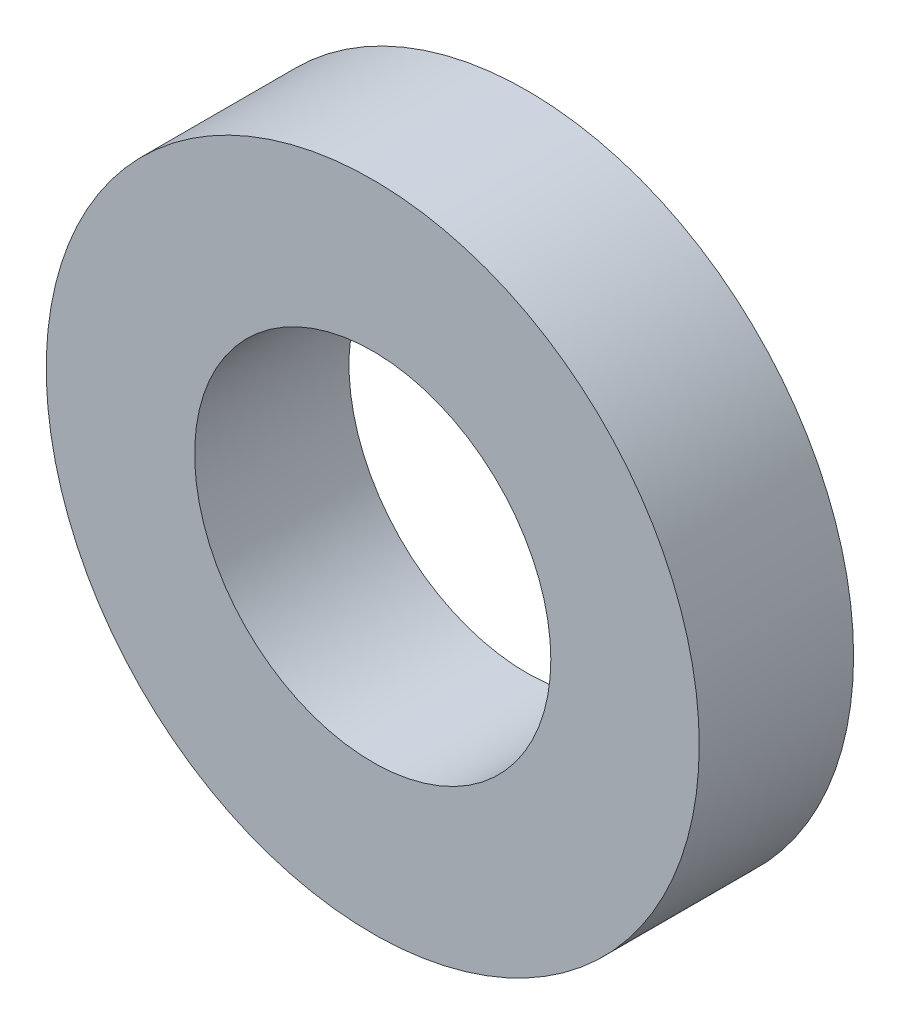
ISO-10303-21;
HEADER;
FILE_DESCRIPTION(('STEP AP214'),'2;1');
FILE_NAME('part.step','',(''),(''),'','','');
FILE_SCHEMA(('AUTOMOTIVE_DESIGN { 1 0 10303 214 1 1 1 1 }'));
ENDSEC;
DATA;
#1=APPLICATION_CONTEXT('core data for automotive mechanical design processes');
#2=APPLICATION_PROTOCOL_DEFINITION('international standard','automotive_design',2000,#1);
#3=PRODUCT_CONTEXT('',#1,'mechanical');
#4=PRODUCT('Part','Part','',(#3));
#5=PRODUCT_RELATED_PRODUCT_CATEGORY('part','',(#4));
#6=PRODUCT_DEFINITION_FORMATION('','',#4);
#7=PRODUCT_DEFINITION_CONTEXT('part definition',#1,'design');
#8=PRODUCT_DEFINITION('design','',#6,#7);
#9=PRODUCT_DEFINITION_SHAPE('','',#8);
#10=(LENGTH_UNIT() NAMED_UNIT(*) SI_UNIT(.MILLI.,.METRE.));
#11=(NAMED_UNIT(*) PLANE_ANGLE_UNIT() SI_UNIT($,.RADIAN.));
#12=(NAMED_UNIT(*) SI_UNIT($,.STERADIAN.) SOLID_ANGLE_UNIT());
#13=UNCERTAINTY_MEASURE_WITH_UNIT(LENGTH_MEASURE(1.E-05),#10,'distance_accuracy_value','');
#14=(GEOMETRIC_REPRESENTATION_CONTEXT(3) GLOBAL_UNCERTAINTY_ASSIGNED_CONTEXT((#13)) GLOBAL_UNIT_ASSIGNED_CONTEXT((#10,
#11,#12)) REPRESENTATION_CONTEXT('',''));
#15=CARTESIAN_POINT('',(0.,0.,0.));
#16=DIRECTION('',(0.,0.,1.));
#17=DIRECTION('',(1.,0.,0.));
#18=AXIS2_PLACEMENT_3D('',#15,#16,#17);
#19=CARTESIAN_POINT('',(0.,0.,-13.));
#20=DIRECTION('',(0.,0.,1.));
#21=DIRECTION('',(1.,0.,0.));
#22=AXIS2_PLACEMENT_3D('',#19,#20,#21);
#23=CYLINDRICAL_SURFACE('',#22,27.5);
#24=CARTESIAN_POINT('',(0.,0.,-13.));
#25=DIRECTION('',(0.,0.,1.));
#26=DIRECTION('',(1.,0.,0.));
#27=AXIS2_PLACEMENT_3D('',#24,#25,#26);
#28=CIRCLE('',#27,27.5);
#29=CARTESIAN_POINT('',(27.5,0.,-13.));
#30=VERTEX_POINT('',#29);
#31=EDGE_CURVE('E10',#30,#30,#28,.T.);
#32=CARTESIAN_POINT('',(0.,0.,0.));
#33=DIRECTION('',(0.,0.,1.));
#34=DIRECTION('',(1.,0.,0.));
#35=AXIS2_PLACEMENT_3D('',#32,#33,#34);
#36=CIRCLE('',#35,27.5);
#37=CARTESIAN_POINT('',(27.5,0.,0.));
#38=VERTEX_POINT('',#37);
#39=EDGE_CURVE('E38',#38,#38,#36,.T.);
#40=CARTESIAN_POINT('',(27.5,0.,-13.));
#41=CARTESIAN_POINT('',(27.5,0.,-12.8645833333333));
#42=CARTESIAN_POINT('',(27.5,0.,-12.7291666666667));
#43=CARTESIAN_POINT('',(27.5,0.,-12.4583333333333));
#44=CARTESIAN_POINT('',(27.5,0.,-12.3229166666667));
#45=CARTESIAN_POINT('',(27.5,0.,-12.0520833333333));
#46=CARTESIAN_POINT('',(27.5,0.,-11.9166666666667));
#47=CARTESIAN_POINT('',(27.5,0.,-11.6458333333333));
#48=CARTESIAN_POINT('',(27.5,0.,-11.5104166666667));
#49=CARTESIAN_POINT('',(27.5,0.,-11.2395833333333));
#50=CARTESIAN_POINT('',(27.5,0.,-11.1041666666667));
#51=CARTESIAN_POINT('',(27.5,0.,-10.8333333333333));
#52=CARTESIAN_POINT('',(27.5,0.,-10.6979166666667));
#53=CARTESIAN_POINT('',(27.5,0.,-10.4270833333333));
#54=CARTESIAN_POINT('',(27.5,0.,-10.2916666666667));
#55=CARTESIAN_POINT('',(27.5,0.,-10.0208333333333));
#56=CARTESIAN_POINT('',(27.5,0.,-9.88541666666667));
#57=CARTESIAN_POINT('',(27.5,0.,-9.61458333333333));
#58=CARTESIAN_POINT('',(27.5,0.,-9.47916666666667));
#59=CARTESIAN_POINT('',(27.5,0.,-9.20833333333333));
#60=CARTESIAN_POINT('',(27.5,0.,-9.07291666666667));
#61=CARTESIAN_POINT('',(27.5,0.,-8.80208333333333));
#62=CARTESIAN_POINT('',(27.5,0.,-8.66666666666667));
#63=CARTESIAN_POINT('',(27.5,0.,-8.39583333333333));
#64=CARTESIAN_POINT('',(27.5,0.,-8.26041666666667));
#65=CARTESIAN_POINT('',(27.5,0.,-7.98958333333333));
#66=CARTESIAN_POINT('',(27.5,0.,-7.85416666666667));
#67=CARTESIAN_POINT('',(27.5,0.,-7.58333333333333));
#68=CARTESIAN_POINT('',(27.5,0.,-7.44791666666667));
#69=CARTESIAN_POINT('',(27.5,0.,-7.17708333333333));
#70=CARTESIAN_POINT('',(27.5,0.,-7.04166666666667));
#71=CARTESIAN_POINT('',(27.5,0.,-6.77083333333333));
#72=CARTESIAN_POINT('',(27.5,0.,-6.63541666666667));
#73=CARTESIAN_POINT('',(27.5,0.,-6.36458333333333));
#74=CARTESIAN_POINT('',(27.5,0.,-6.22916666666667));
#75=CARTESIAN_POINT('',(27.5,0.,-5.95833333333333));
#76=CARTESIAN_POINT('',(27.5,0.,-5.82291666666667));
#77=CARTESIAN_POINT('',(27.5,0.,-5.55208333333333));
#78=CARTESIAN_POINT('',(27.5,0.,-5.41666666666667));
#79=CARTESIAN_POINT('',(27.5,0.,-5.14583333333333));
#80=CARTESIAN_POINT('',(27.5,0.,-5.01041666666667));
#81=CARTESIAN_POINT('',(27.5,0.,-4.73958333333333));
#82=CARTESIAN_POINT('',(27.5,0.,-4.60416666666667));
#83=CARTESIAN_POINT('',(27.5,0.,-4.33333333333333));
#84=CARTESIAN_POINT('',(27.5,0.,-4.19791666666667));
#85=CARTESIAN_POINT('',(27.5,0.,-3.92708333333333));
#86=CARTESIAN_POINT('',(27.5,0.,-3.79166666666667));
#87=CARTESIAN_POINT('',(27.5,0.,-3.52083333333333));
#88=CARTESIAN_POINT('',(27.5,0.,-3.38541666666667));
#89=CARTESIAN_POINT('',(27.5,0.,-3.11458333333333));
#90=CARTESIAN_POINT('',(27.5,0.,-2.97916666666667));
#91=CARTESIAN_POINT('',(27.5,0.,-2.70833333333333));
#92=CARTESIAN_POINT('',(27.5,0.,-2.57291666666667));
#93=CARTESIAN_POINT('',(27.5,0.,-2.30208333333333));
#94=CARTESIAN_POINT('',(27.5,0.,-2.16666666666667));
#95=CARTESIAN_POINT('',(27.5,0.,-1.89583333333333));
#96=CARTESIAN_POINT('',(27.5,0.,-1.76041666666667));
#97=CARTESIAN_POINT('',(27.5,0.,-1.48958333333333));
#98=CARTESIAN_POINT('',(27.5,0.,-1.35416666666667));
#99=CARTESIAN_POINT('',(27.5,0.,-1.08333333333333));
#100=CARTESIAN_POINT('',(27.5,0.,-0.947916666666667));
#101=CARTESIAN_POINT('',(27.5,0.,-0.677083333333334));
#102=CARTESIAN_POINT('',(27.5,0.,-0.541666666666667));
#103=CARTESIAN_POINT('',(27.5,0.,-0.270833333333334));
#104=CARTESIAN_POINT('',(27.5,0.,-0.135416666666667));
#105=CARTESIAN_POINT('',(27.5,0.,0.));
#106=B_SPLINE_CURVE_WITH_KNOTS('',3,(#40,#41,#42,#43,#44,#45,#46,#47,#48,#49,#50,#51,#52,#53,
#54,#55,#56,#57,#58,#59,#60,#61,#62,#63,#64,#65,#66,#67,#68,#69,#70,#71,#72,#73,#74,#75,#76,#77,
#78,#79,#80,#81,#82,#83,#84,#85,#86,#87,#88,#89,#90,#91,#92,#93,#94,#95,#96,#97,#98,#99,#100,
#101,#102,#103,#104,#105),.UNSPECIFIED.,.F.,.F.,(4,2,2,2,2,2,2,2,2,2,2,2,2,2,2,2,2,2,2,2,2,2,2,
2,2,2,2,2,2,2,2,2,4),(0.,0.406249999999999,0.812499999999999,1.21875,1.625,2.03125,2.4375,
2.84375,3.25,3.65625,4.0625,4.46875,4.875,5.28125,5.6875,6.09375,6.5,6.90625,7.3125,7.71875,
8.125,8.53125,8.9375,9.34375,9.75,10.15625,10.5625,10.96875,11.375,11.78125,12.1875,12.59375,
13.),.UNSPECIFIED.);
#107=EDGE_CURVE('BSEAM35',#30,#38,#106,.T.);
#108=ORIENTED_EDGE('',*,*,#31,.T.);
#109=ORIENTED_EDGE('',*,*,#39,.F.);
#110=ORIENTED_EDGE('',*,*,#107,.T.);
#111=ORIENTED_EDGE('',*,*,#107,.F.);
#112=EDGE_LOOP('',(#108,#110,#109,#111));
#113=FACE_BOUND('',#112,.T.);
#114=ADVANCED_FACE('F35',(#113),#23,.T.);
#115=CARTESIAN_POINT('',(0.,0.,-13.));
#116=DIRECTION('',(0.,0.,1.));
#117=DIRECTION('',(1.,0.,0.));
#118=AXIS2_PLACEMENT_3D('',#115,#116,#117);
#119=PLANE('',#118);
#120=CARTESIAN_POINT('',(0.,0.,-13.));
#121=DIRECTION('',(0.,0.,1.));
#122=DIRECTION('',(1.,0.,0.));
#123=AXIS2_PLACEMENT_3D('',#120,#121,#122);
#124=CIRCLE('',#123,15.);
#125=CARTESIAN_POINT('',(15.,0.,-13.));
#126=VERTEX_POINT('',#125);
#127=EDGE_CURVE('E45',#126,#126,#124,.T.);
#128=ORIENTED_EDGE('',*,*,#127,.T.);
#129=EDGE_LOOP('',(#128));
#130=FACE_BOUND('',#129,.T.);
#131=ORIENTED_EDGE('',*,*,#31,.F.);
#132=EDGE_LOOP('',(#131));
#133=FACE_BOUND('',#132,.T.);
#134=ADVANCED_FACE('F53',(#130,#133),#119,.F.);
#135=CARTESIAN_POINT('',(0.,0.,0.));
#136=DIRECTION('',(0.,0.,1.));
#137=DIRECTION('',(1.,0.,0.));
#138=AXIS2_PLACEMENT_3D('',#135,#136,#137);
#139=PLANE('',#138);
#140=CARTESIAN_POINT('',(0.,0.,0.));
#141=DIRECTION('',(0.,0.,1.));
#142=DIRECTION('',(1.,0.,0.));
#143=AXIS2_PLACEMENT_3D('',#140,#141,#142);
#144=CIRCLE('',#143,15.);
#145=CARTESIAN_POINT('',(15.,0.,0.));
#146=VERTEX_POINT('',#145);
#147=EDGE_CURVE('E47',#146,#146,#144,.T.);
#148=ORIENTED_EDGE('',*,*,#147,.F.);
#149=EDGE_LOOP('',(#148));
#150=FACE_BOUND('',#149,.T.);
#151=ORIENTED_EDGE('',*,*,#39,.T.);
#152=EDGE_LOOP('',(#151));
#153=FACE_BOUND('',#152,.T.);
#154=ADVANCED_FACE('F59',(#150,#153),#139,.T.);
#155=CARTESIAN_POINT('',(0.,0.,-13.));
#156=DIRECTION('',(0.,0.,1.));
#157=DIRECTION('',(1.,0.,0.));
#158=AXIS2_PLACEMENT_3D('',#155,#156,#157);
#159=CYLINDRICAL_SURFACE('',#158,15.);
#160=CARTESIAN_POINT('',(15.,0.,-13.));
#161=CARTESIAN_POINT('',(15.,0.,-12.8645833333333));
#162=CARTESIAN_POINT('',(15.,0.,-12.7291666666667));
#163=CARTESIAN_POINT('',(15.,0.,-12.4583333333333));
#164=CARTESIAN_POINT('',(15.,0.,-12.3229166666667));
#165=CARTESIAN_POINT('',(15.,0.,-12.0520833333333));
#166=CARTESIAN_POINT('',(15.,0.,-11.9166666666667));
#167=CARTESIAN_POINT('',(15.,0.,-11.6458333333333));
#168=CARTESIAN_POINT('',(15.,0.,-11.5104166666667));
#169=CARTESIAN_POINT('',(15.,0.,-11.2395833333333));
#170=CARTESIAN_POINT('',(15.,0.,-11.1041666666667));
#171=CARTESIAN_POINT('',(15.,0.,-10.8333333333333));
#172=CARTESIAN_POINT('',(15.,0.,-10.6979166666667));
#173=CARTESIAN_POINT('',(15.,0.,-10.4270833333333));
#174=CARTESIAN_POINT('',(15.,0.,-10.2916666666667));
#175=CARTESIAN_POINT('',(15.,0.,-10.0208333333333));
#176=CARTESIAN_POINT('',(15.,0.,-9.88541666666667));
#177=CARTESIAN_POINT('',(15.,0.,-9.61458333333333));
#178=CARTESIAN_POINT('',(15.,0.,-9.47916666666667));
#179=CARTESIAN_POINT('',(15.,0.,-9.20833333333333));
#180=CARTESIAN_POINT('',(15.,0.,-9.07291666666667));
#181=CARTESIAN_POINT('',(15.,0.,-8.80208333333333));
#182=CARTESIAN_POINT('',(15.,0.,-8.66666666666667));
#183=CARTESIAN_POINT('',(15.,0.,-8.39583333333333));
#184=CARTESIAN_POINT('',(15.,0.,-8.26041666666667));
#185=CARTESIAN_POINT('',(15.,0.,-7.98958333333333));
#186=CARTESIAN_POINT('',(15.,0.,-7.85416666666667));
#187=CARTESIAN_POINT('',(15.,0.,-7.58333333333333));
#188=CARTESIAN_POINT('',(15.,0.,-7.44791666666667));
#189=CARTESIAN_POINT('',(15.,0.,-7.17708333333333));
#190=CARTESIAN_POINT('',(15.,0.,-7.04166666666667));
#191=CARTESIAN_POINT('',(15.,0.,-6.77083333333333));
#192=CARTESIAN_POINT('',(15.,0.,-6.63541666666667));
#193=CARTESIAN_POINT('',(15.,0.,-6.36458333333333));
#194=CARTESIAN_POINT('',(15.,0.,-6.22916666666667));
#195=CARTESIAN_POINT('',(15.,0.,-5.95833333333333));
#196=CARTESIAN_POINT('',(15.,0.,-5.82291666666667));
#197=CARTESIAN_POINT('',(15.,0.,-5.55208333333333));
#198=CARTESIAN_POINT('',(15.,0.,-5.41666666666667));
#199=CARTESIAN_POINT('',(15.,0.,-5.14583333333333));
#200=CARTESIAN_POINT('',(15.,0.,-5.01041666666667));
#201=CARTESIAN_POINT('',(15.,0.,-4.73958333333333));
#202=CARTESIAN_POINT('',(15.,0.,-4.60416666666667));
#203=CARTESIAN_POINT('',(15.,0.,-4.33333333333333));
#204=CARTESIAN_POINT('',(15.,0.,-4.19791666666667));
#205=CARTESIAN_POINT('',(15.,0.,-3.92708333333333));
#206=CARTESIAN_POINT('',(15.,0.,-3.79166666666667));
#207=CARTESIAN_POINT('',(15.,0.,-3.52083333333333));
#208=CARTESIAN_POINT('',(15.,0.,-3.38541666666667));
#209=CARTESIAN_POINT('',(15.,0.,-3.11458333333333));
#210=CARTESIAN_POINT('',(15.,0.,-2.97916666666667));
#211=CARTESIAN_POINT('',(15.,0.,-2.70833333333333));
#212=CARTESIAN_POINT('',(15.,0.,-2.57291666666667));
#213=CARTESIAN_POINT('',(15.,0.,-2.30208333333333));
#214=CARTESIAN_POINT('',(15.,0.,-2.16666666666667));
#215=CARTESIAN_POINT('',(15.,0.,-1.89583333333333));
#216=CARTESIAN_POINT('',(15.,0.,-1.76041666666667));
#217=CARTESIAN_POINT('',(15.,0.,-1.48958333333333));
#218=CARTESIAN_POINT('',(15.,0.,-1.35416666666667));
#219=CARTESIAN_POINT('',(15.,0.,-1.08333333333333));
#220=CARTESIAN_POINT('',(15.,0.,-0.947916666666667));
#221=CARTESIAN_POINT('',(15.,0.,-0.677083333333334));
#222=CARTESIAN_POINT('',(15.,0.,-0.541666666666667));
#223=CARTESIAN_POINT('',(15.,0.,-0.270833333333334));
#224=CARTESIAN_POINT('',(15.,0.,-0.135416666666667));
#225=CARTESIAN_POINT('',(15.,0.,0.));
#226=B_SPLINE_CURVE_WITH_KNOTS('',3,(#160,#161,#162,#163,#164,#165,#166,#167,#168,#169,#170,
#171,#172,#173,#174,#175,#176,#177,#178,#179,#180,#181,#182,#183,#184,#185,#186,#187,#188,#189,
#190,#191,#192,#193,#194,#195,#196,#197,#198,#199,#200,#201,#202,#203,#204,#205,#206,#207,#208,
#209,#210,#211,#212,#213,#214,#215,#216,#217,#218,#219,#220,#221,#222,#223,#224,#225),
.UNSPECIFIED.,.F.,.F.,(4,2,2,2,2,2,2,2,2,2,2,2,2,2,2,2,2,2,2,2,2,2,2,2,2,2,2,2,2,2,2,2,4),(0.,
0.406249999999999,0.812499999999999,1.21875,1.625,2.03125,2.4375,2.84375,3.25,3.65625,4.0625,
4.46875,4.875,5.28125,5.6875,6.09375,6.5,6.90625,7.3125,7.71875,8.125,8.53125,8.9375,9.34375,
9.75,10.15625,10.5625,10.96875,11.375,11.78125,12.1875,12.59375,13.),.UNSPECIFIED.);
#227=EDGE_CURVE('BSEAM56',#126,#146,#226,.T.);
#228=ORIENTED_EDGE('',*,*,#127,.F.);
#229=ORIENTED_EDGE('',*,*,#147,.T.);
#230=ORIENTED_EDGE('',*,*,#227,.T.);
#231=ORIENTED_EDGE('',*,*,#227,.F.);
#232=EDGE_LOOP('',(#228,#230,#229,#231));
#233=FACE_BOUND('',#232,.T.);
#234=ADVANCED_FACE('F56',(#233),#159,.F.);
#235=CLOSED_SHELL('',(#114,#134,#154,#234));
#236=MANIFOLD_SOLID_BREP('B2',#235);
#237=ADVANCED_BREP_SHAPE_REPRESENTATION('',(#18,#236),#14);
#238=SHAPE_DEFINITION_REPRESENTATION(#9,#237);
ENDSEC;
END-ISO-10303-21;
